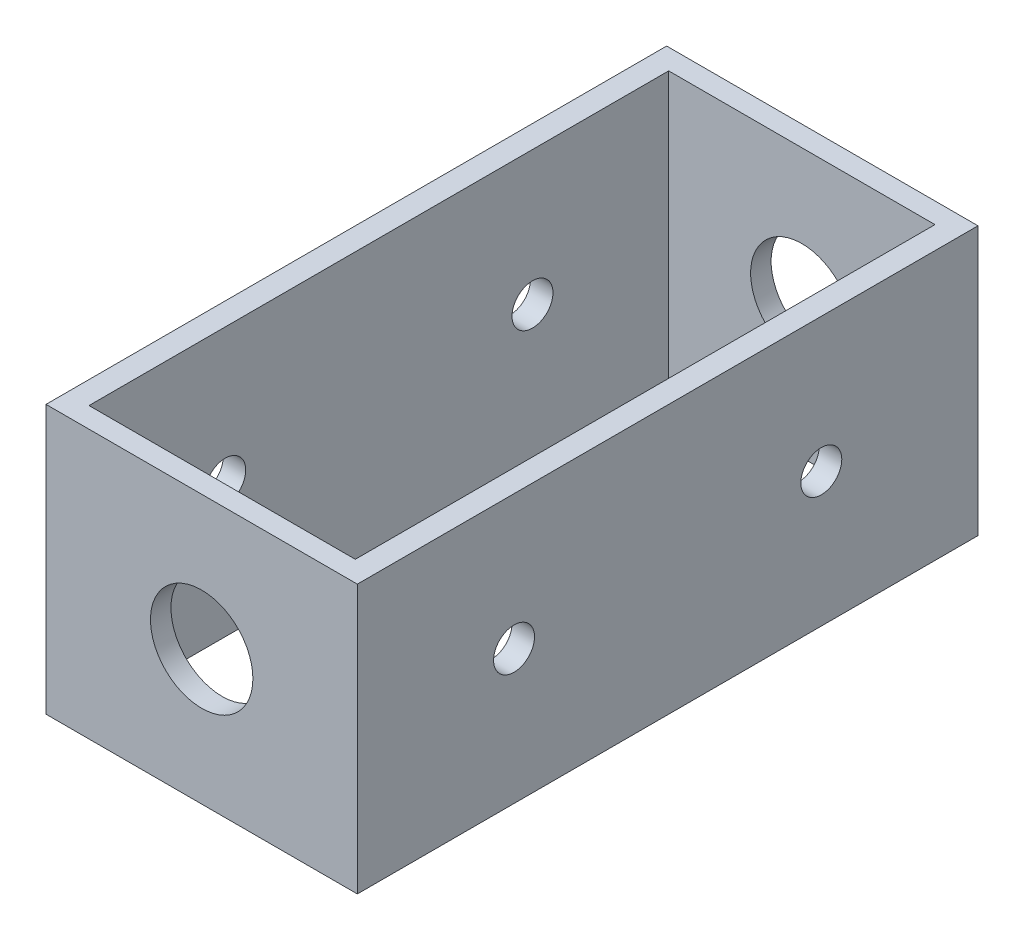
ISO-10303-21;
HEADER;
FILE_DESCRIPTION(('STEP AP214'),'2;1');
FILE_NAME('part.step','',(''),(''),'','','');
FILE_SCHEMA(('AUTOMOTIVE_DESIGN { 1 0 10303 214 1 1 1 1 }'));
ENDSEC;
DATA;
#1=APPLICATION_CONTEXT('core data for automotive mechanical design processes');
#2=APPLICATION_PROTOCOL_DEFINITION('international standard','automotive_design',2000,#1);
#3=PRODUCT_CONTEXT('',#1,'mechanical');
#4=PRODUCT('Part','Part','',(#3));
#5=PRODUCT_RELATED_PRODUCT_CATEGORY('part','',(#4));
#6=PRODUCT_DEFINITION_FORMATION('','',#4);
#7=PRODUCT_DEFINITION_CONTEXT('part definition',#1,'design');
#8=PRODUCT_DEFINITION('design','',#6,#7);
#9=PRODUCT_DEFINITION_SHAPE('','',#8);
#10=(LENGTH_UNIT() NAMED_UNIT(*) SI_UNIT(.MILLI.,.METRE.));
#11=(NAMED_UNIT(*) PLANE_ANGLE_UNIT() SI_UNIT($,.RADIAN.));
#12=(NAMED_UNIT(*) SI_UNIT($,.STERADIAN.) SOLID_ANGLE_UNIT());
#13=UNCERTAINTY_MEASURE_WITH_UNIT(LENGTH_MEASURE(1.E-05),#10,'distance_accuracy_value','');
#14=(GEOMETRIC_REPRESENTATION_CONTEXT(3) GLOBAL_UNCERTAINTY_ASSIGNED_CONTEXT((#13)) GLOBAL_UNIT_ASSIGNED_CONTEXT((#10,
#11,#12)) REPRESENTATION_CONTEXT('',''));
#15=CARTESIAN_POINT('',(0.,0.,0.));
#16=DIRECTION('',(0.,0.,1.));
#17=DIRECTION('',(1.,0.,0.));
#18=AXIS2_PLACEMENT_3D('',#15,#16,#17);
#19=CARTESIAN_POINT('',(0.,13.1,0.));
#20=DIRECTION('',(0.,-1.,0.));
#21=DIRECTION('',(0.,0.,-1.));
#22=AXIS2_PLACEMENT_3D('',#19,#20,#21);
#23=PLANE('',#22);
#24=DIRECTION('',(0.,0.,-1.));
#25=VECTOR('',#24,1.);
#26=CARTESIAN_POINT('',(7.6,13.1,15.15));
#27=LINE('',#26,#25);
#28=CARTESIAN_POINT('',(7.6,13.1,15.15));
#29=VERTEX_POINT('',#28);
#30=CARTESIAN_POINT('',(7.6,13.1,-15.15));
#31=VERTEX_POINT('',#30);
#32=EDGE_CURVE('E157',#29,#31,#27,.T.);
#33=ORIENTED_EDGE('',*,*,#32,.T.);
#34=DIRECTION('',(-1.,0.,0.));
#35=VECTOR('',#34,1.);
#36=CARTESIAN_POINT('',(-7.6,13.1,-15.15));
#37=LINE('',#36,#35);
#38=CARTESIAN_POINT('',(-7.6,13.1,-15.15));
#39=VERTEX_POINT('',#38);
#40=EDGE_CURVE('E161',#31,#39,#37,.T.);
#41=ORIENTED_EDGE('',*,*,#40,.T.);
#42=DIRECTION('',(0.,0.,1.));
#43=VECTOR('',#42,1.);
#44=CARTESIAN_POINT('',(-7.6,13.1,15.15));
#45=LINE('',#44,#43);
#46=CARTESIAN_POINT('',(-7.6,13.1,15.15));
#47=VERTEX_POINT('',#46);
#48=EDGE_CURVE('E165',#39,#47,#45,.T.);
#49=ORIENTED_EDGE('',*,*,#48,.T.);
#50=DIRECTION('',(1.,0.,0.));
#51=VECTOR('',#50,1.);
#52=CARTESIAN_POINT('',(-7.6,13.1,15.15));
#53=LINE('',#52,#51);
#54=EDGE_CURVE('E168',#47,#29,#53,.T.);
#55=ORIENTED_EDGE('',*,*,#54,.T.);
#56=EDGE_LOOP('',(#33,#41,#49,#55));
#57=FACE_BOUND('',#56,.T.);
#58=DIRECTION('',(0.,0.,-1.));
#59=VECTOR('',#58,1.);
#60=CARTESIAN_POINT('',(6.5,13.1,14.15));
#61=LINE('',#60,#59);
#62=CARTESIAN_POINT('',(6.5,13.1,14.15));
#63=VERTEX_POINT('',#62);
#64=CARTESIAN_POINT('',(6.5,13.1,-14.15));
#65=VERTEX_POINT('',#64);
#66=EDGE_CURVE('E107',#63,#65,#61,.T.);
#67=ORIENTED_EDGE('',*,*,#66,.F.);
#68=DIRECTION('',(1.,0.,0.));
#69=VECTOR('',#68,1.);
#70=CARTESIAN_POINT('',(-6.5,13.1,14.15));
#71=LINE('',#70,#69);
#72=CARTESIAN_POINT('',(-6.5,13.1,14.15));
#73=VERTEX_POINT('',#72);
#74=EDGE_CURVE('E133',#73,#63,#71,.T.);
#75=ORIENTED_EDGE('',*,*,#74,.F.);
#76=DIRECTION('',(0.,0.,1.));
#77=VECTOR('',#76,1.);
#78=CARTESIAN_POINT('',(-6.5,13.1,14.15));
#79=LINE('',#78,#77);
#80=CARTESIAN_POINT('',(-6.5,13.1,-14.15));
#81=VERTEX_POINT('',#80);
#82=EDGE_CURVE('E129',#81,#73,#79,.T.);
#83=ORIENTED_EDGE('',*,*,#82,.F.);
#84=DIRECTION('',(-1.,0.,0.));
#85=VECTOR('',#84,1.);
#86=CARTESIAN_POINT('',(-6.5,13.1,-14.15));
#87=LINE('',#86,#85);
#88=EDGE_CURVE('E116',#65,#81,#87,.T.);
#89=ORIENTED_EDGE('',*,*,#88,.F.);
#90=EDGE_LOOP('',(#67,#75,#83,#89));
#91=FACE_BOUND('',#90,.T.);
#92=ADVANCED_FACE('F39',(#57,#91),#23,.F.);
#93=CARTESIAN_POINT('',(0.,0.,0.));
#94=DIRECTION('',(0.,-1.,0.));
#95=DIRECTION('',(0.,0.,-1.));
#96=AXIS2_PLACEMENT_3D('',#93,#94,#95);
#97=PLANE('',#96);
#98=DIRECTION('',(0.,0.,-1.));
#99=VECTOR('',#98,1.);
#100=CARTESIAN_POINT('',(7.6,0.,15.15));
#101=LINE('',#100,#99);
#102=CARTESIAN_POINT('',(7.6,0.,15.15));
#103=VERTEX_POINT('',#102);
#104=CARTESIAN_POINT('',(7.6,0.,-15.15));
#105=VERTEX_POINT('',#104);
#106=EDGE_CURVE('E125',#103,#105,#101,.T.);
#107=ORIENTED_EDGE('',*,*,#106,.F.);
#108=DIRECTION('',(1.,0.,0.));
#109=VECTOR('',#108,1.);
#110=CARTESIAN_POINT('',(-7.6,0.,15.15));
#111=LINE('',#110,#109);
#112=CARTESIAN_POINT('',(-7.6,0.,15.15));
#113=VERTEX_POINT('',#112);
#114=EDGE_CURVE('E162',#113,#103,#111,.T.);
#115=ORIENTED_EDGE('',*,*,#114,.F.);
#116=DIRECTION('',(0.,0.,1.));
#117=VECTOR('',#116,1.);
#118=CARTESIAN_POINT('',(-7.6,0.,15.15));
#119=LINE('',#118,#117);
#120=CARTESIAN_POINT('',(-7.6,0.,-15.15));
#121=VERTEX_POINT('',#120);
#122=EDGE_CURVE('E178',#121,#113,#119,.T.);
#123=ORIENTED_EDGE('',*,*,#122,.F.);
#124=DIRECTION('',(-1.,0.,0.));
#125=VECTOR('',#124,1.);
#126=CARTESIAN_POINT('',(-7.6,0.,-15.15));
#127=LINE('',#126,#125);
#128=EDGE_CURVE('E175',#105,#121,#127,.T.);
#129=ORIENTED_EDGE('',*,*,#128,.F.);
#130=EDGE_LOOP('',(#107,#115,#123,#129));
#131=FACE_BOUND('',#130,.T.);
#132=DIRECTION('',(1.,0.,0.));
#133=VECTOR('',#132,1.);
#134=CARTESIAN_POINT('',(-6.5,0.,14.15));
#135=LINE('',#134,#133);
#136=CARTESIAN_POINT('',(-6.5,0.,14.15));
#137=VERTEX_POINT('',#136);
#138=CARTESIAN_POINT('',(6.5,0.,14.15));
#139=VERTEX_POINT('',#138);
#140=EDGE_CURVE('E117',#137,#139,#135,.T.);
#141=ORIENTED_EDGE('',*,*,#140,.T.);
#142=DIRECTION('',(0.,0.,-1.));
#143=VECTOR('',#142,1.);
#144=CARTESIAN_POINT('',(6.5,0.,14.15));
#145=LINE('',#144,#143);
#146=CARTESIAN_POINT('',(6.5,0.,-14.15));
#147=VERTEX_POINT('',#146);
#148=EDGE_CURVE('E65',#139,#147,#145,.T.);
#149=ORIENTED_EDGE('',*,*,#148,.T.);
#150=DIRECTION('',(-1.,0.,0.));
#151=VECTOR('',#150,1.);
#152=CARTESIAN_POINT('',(-6.5,0.,-14.15));
#153=LINE('',#152,#151);
#154=CARTESIAN_POINT('',(-6.5,0.,-14.15));
#155=VERTEX_POINT('',#154);
#156=EDGE_CURVE('E123',#147,#155,#153,.T.);
#157=ORIENTED_EDGE('',*,*,#156,.T.);
#158=DIRECTION('',(0.,0.,1.));
#159=VECTOR('',#158,1.);
#160=CARTESIAN_POINT('',(-6.5,0.,14.15));
#161=LINE('',#160,#159);
#162=EDGE_CURVE('E144',#155,#137,#161,.T.);
#163=ORIENTED_EDGE('',*,*,#162,.T.);
#164=EDGE_LOOP('',(#141,#149,#157,#163));
#165=FACE_BOUND('',#164,.T.);
#166=ADVANCED_FACE('F253',(#131,#165),#97,.T.);
#167=CARTESIAN_POINT('',(7.6,13.1,15.15));
#168=DIRECTION('',(-1.,0.,0.));
#169=DIRECTION('',(0.,0.,1.));
#170=AXIS2_PLACEMENT_3D('',#167,#168,#169);
#171=PLANE('',#170);
#172=CARTESIAN_POINT('',(7.6,6.55,7.5));
#173=DIRECTION('',(1.,0.,0.));
#174=DIRECTION('',(0.,0.,-1.));
#175=AXIS2_PLACEMENT_3D('',#172,#173,#174);
#176=CIRCLE('',#175,1.);
#177=CARTESIAN_POINT('',(7.6,6.55,6.5));
#178=VERTEX_POINT('',#177);
#179=EDGE_CURVE('E220',#178,#178,#176,.T.);
#180=ORIENTED_EDGE('',*,*,#179,.F.);
#181=EDGE_LOOP('',(#180));
#182=FACE_BOUND('',#181,.T.);
#183=CARTESIAN_POINT('',(7.6,6.55,-7.5));
#184=DIRECTION('',(1.,0.,0.));
#185=DIRECTION('',(0.,0.,-1.));
#186=AXIS2_PLACEMENT_3D('',#183,#184,#185);
#187=CIRCLE('',#186,1.);
#188=CARTESIAN_POINT('',(7.6,6.55,-8.5));
#189=VERTEX_POINT('',#188);
#190=EDGE_CURVE('E211',#189,#189,#187,.T.);
#191=ORIENTED_EDGE('',*,*,#190,.F.);
#192=EDGE_LOOP('',(#191));
#193=FACE_BOUND('',#192,.T.);
#194=ORIENTED_EDGE('',*,*,#106,.T.);
#195=DIRECTION('',(0.,-1.,0.));
#196=VECTOR('',#195,1.);
#197=CARTESIAN_POINT('',(7.6,13.1,-15.15));
#198=LINE('',#197,#196);
#199=EDGE_CURVE('E11',#31,#105,#198,.T.);
#200=ORIENTED_EDGE('',*,*,#199,.F.);
#201=ORIENTED_EDGE('',*,*,#32,.F.);
#202=DIRECTION('',(0.,-1.,0.));
#203=VECTOR('',#202,1.);
#204=CARTESIAN_POINT('',(7.6,13.1,15.15));
#205=LINE('',#204,#203);
#206=EDGE_CURVE('E171',#29,#103,#205,.T.);
#207=ORIENTED_EDGE('',*,*,#206,.T.);
#208=EDGE_LOOP('',(#194,#200,#201,#207));
#209=FACE_BOUND('',#208,.T.);
#210=ADVANCED_FACE('F41',(#182,#193,#209),#171,.F.);
#211=CARTESIAN_POINT('',(-7.6,13.1,-15.15));
#212=DIRECTION('',(0.,0.,1.));
#213=DIRECTION('',(1.,0.,0.));
#214=AXIS2_PLACEMENT_3D('',#211,#212,#213);
#215=PLANE('',#214);
#216=CARTESIAN_POINT('',(0.,6.55,-15.15));
#217=DIRECTION('',(0.,0.,1.));
#218=DIRECTION('',(1.,0.,0.));
#219=AXIS2_PLACEMENT_3D('',#216,#217,#218);
#220=CIRCLE('',#219,2.5);
#221=CARTESIAN_POINT('',(2.5,6.55,-15.15));
#222=VERTEX_POINT('',#221);
#223=EDGE_CURVE('E234',#222,#222,#220,.T.);
#224=ORIENTED_EDGE('',*,*,#223,.T.);
#225=EDGE_LOOP('',(#224));
#226=FACE_BOUND('',#225,.T.);
#227=ORIENTED_EDGE('',*,*,#128,.T.);
#228=DIRECTION('',(0.,-1.,0.));
#229=VECTOR('',#228,1.);
#230=CARTESIAN_POINT('',(-7.6,13.1,-15.15));
#231=LINE('',#230,#229);
#232=EDGE_CURVE('E49',#39,#121,#231,.T.);
#233=ORIENTED_EDGE('',*,*,#232,.F.);
#234=ORIENTED_EDGE('',*,*,#40,.F.);
#235=ORIENTED_EDGE('',*,*,#199,.T.);
#236=EDGE_LOOP('',(#227,#233,#234,#235));
#237=FACE_BOUND('',#236,.T.);
#238=ADVANCED_FACE('F280',(#226,#237),#215,.F.);
#239=CARTESIAN_POINT('',(-7.6,13.1,15.15));
#240=DIRECTION('',(1.,0.,0.));
#241=DIRECTION('',(0.,0.,-1.));
#242=AXIS2_PLACEMENT_3D('',#239,#240,#241);
#243=PLANE('',#242);
#244=CARTESIAN_POINT('',(-7.6,6.55,7.5));
#245=DIRECTION('',(1.,0.,0.));
#246=DIRECTION('',(0.,0.,-1.));
#247=AXIS2_PLACEMENT_3D('',#244,#245,#246);
#248=CIRCLE('',#247,1.);
#249=CARTESIAN_POINT('',(-7.6,6.55,6.5));
#250=VERTEX_POINT('',#249);
#251=EDGE_CURVE('E197',#250,#250,#248,.T.);
#252=ORIENTED_EDGE('',*,*,#251,.T.);
#253=EDGE_LOOP('',(#252));
#254=FACE_BOUND('',#253,.T.);
#255=CARTESIAN_POINT('',(-7.6,6.55,-7.5));
#256=DIRECTION('',(1.,0.,0.));
#257=DIRECTION('',(0.,0.,-1.));
#258=AXIS2_PLACEMENT_3D('',#255,#256,#257);
#259=CIRCLE('',#258,1.);
#260=CARTESIAN_POINT('',(-7.6,6.55,-8.5));
#261=VERTEX_POINT('',#260);
#262=EDGE_CURVE('E215',#261,#261,#259,.T.);
#263=ORIENTED_EDGE('',*,*,#262,.T.);
#264=EDGE_LOOP('',(#263));
#265=FACE_BOUND('',#264,.T.);
#266=ORIENTED_EDGE('',*,*,#122,.T.);
#267=DIRECTION('',(0.,-1.,0.));
#268=VECTOR('',#267,1.);
#269=CARTESIAN_POINT('',(-7.6,13.1,15.15));
#270=LINE('',#269,#268);
#271=EDGE_CURVE('E186',#47,#113,#270,.T.);
#272=ORIENTED_EDGE('',*,*,#271,.F.);
#273=ORIENTED_EDGE('',*,*,#48,.F.);
#274=ORIENTED_EDGE('',*,*,#232,.T.);
#275=EDGE_LOOP('',(#266,#272,#273,#274));
#276=FACE_BOUND('',#275,.T.);
#277=ADVANCED_FACE('F277',(#254,#265,#276),#243,.F.);
#278=CARTESIAN_POINT('',(-7.6,13.1,15.15));
#279=DIRECTION('',(0.,0.,-1.));
#280=DIRECTION('',(-1.,0.,0.));
#281=AXIS2_PLACEMENT_3D('',#278,#279,#280);
#282=PLANE('',#281);
#283=CARTESIAN_POINT('',(0.,6.55,15.15));
#284=DIRECTION('',(0.,0.,1.));
#285=DIRECTION('',(1.,0.,0.));
#286=AXIS2_PLACEMENT_3D('',#283,#284,#285);
#287=CIRCLE('',#286,2.5);
#288=CARTESIAN_POINT('',(2.5,6.55,15.15));
#289=VERTEX_POINT('',#288);
#290=EDGE_CURVE('E230',#289,#289,#287,.T.);
#291=ORIENTED_EDGE('',*,*,#290,.F.);
#292=EDGE_LOOP('',(#291));
#293=FACE_BOUND('',#292,.T.);
#294=ORIENTED_EDGE('',*,*,#114,.T.);
#295=ORIENTED_EDGE('',*,*,#206,.F.);
#296=ORIENTED_EDGE('',*,*,#54,.F.);
#297=ORIENTED_EDGE('',*,*,#271,.T.);
#298=EDGE_LOOP('',(#294,#295,#296,#297));
#299=FACE_BOUND('',#298,.T.);
#300=ADVANCED_FACE('F274',(#293,#299),#282,.F.);
#301=CARTESIAN_POINT('',(6.5,13.1,14.15));
#302=DIRECTION('',(-1.,0.,0.));
#303=DIRECTION('',(0.,0.,1.));
#304=AXIS2_PLACEMENT_3D('',#301,#302,#303);
#305=PLANE('',#304);
#306=CARTESIAN_POINT('',(6.5,6.55,7.5));
#307=DIRECTION('',(-1.,0.,0.));
#308=DIRECTION('',(0.,0.,1.));
#309=AXIS2_PLACEMENT_3D('',#306,#307,#308);
#310=CIRCLE('',#309,1.);
#311=CARTESIAN_POINT('',(6.5,6.55,8.5));
#312=VERTEX_POINT('',#311);
#313=EDGE_CURVE('E141',#312,#312,#310,.T.);
#314=ORIENTED_EDGE('',*,*,#313,.F.);
#315=EDGE_LOOP('',(#314));
#316=FACE_BOUND('',#315,.T.);
#317=CARTESIAN_POINT('',(6.5,6.55,-7.5));
#318=DIRECTION('',(-1.,0.,0.));
#319=DIRECTION('',(0.,0.,1.));
#320=AXIS2_PLACEMENT_3D('',#317,#318,#319);
#321=CIRCLE('',#320,1.);
#322=CARTESIAN_POINT('',(6.5,6.55,-6.5));
#323=VERTEX_POINT('',#322);
#324=EDGE_CURVE('E196',#323,#323,#321,.T.);
#325=ORIENTED_EDGE('',*,*,#324,.F.);
#326=EDGE_LOOP('',(#325));
#327=FACE_BOUND('',#326,.T.);
#328=ORIENTED_EDGE('',*,*,#148,.F.);
#329=DIRECTION('',(0.,-1.,0.));
#330=VECTOR('',#329,1.);
#331=CARTESIAN_POINT('',(6.5,13.1,14.15));
#332=LINE('',#331,#330);
#333=EDGE_CURVE('E111',#63,#139,#332,.T.);
#334=ORIENTED_EDGE('',*,*,#333,.F.);
#335=ORIENTED_EDGE('',*,*,#66,.T.);
#336=DIRECTION('',(0.,-1.,0.));
#337=VECTOR('',#336,1.);
#338=CARTESIAN_POINT('',(6.5,13.1,-14.15));
#339=LINE('',#338,#337);
#340=EDGE_CURVE('E110',#65,#147,#339,.T.);
#341=ORIENTED_EDGE('',*,*,#340,.T.);
#342=EDGE_LOOP('',(#328,#334,#335,#341));
#343=FACE_BOUND('',#342,.T.);
#344=ADVANCED_FACE('F109',(#316,#327,#343),#305,.T.);
#345=CARTESIAN_POINT('',(-6.5,13.1,-14.15));
#346=DIRECTION('',(0.,0.,1.));
#347=DIRECTION('',(1.,0.,0.));
#348=AXIS2_PLACEMENT_3D('',#345,#346,#347);
#349=PLANE('',#348);
#350=CARTESIAN_POINT('',(0.,6.55,-14.15));
#351=DIRECTION('',(0.,0.,1.));
#352=DIRECTION('',(1.,0.,0.));
#353=AXIS2_PLACEMENT_3D('',#350,#351,#352);
#354=CIRCLE('',#353,2.5);
#355=CARTESIAN_POINT('',(2.5,6.55,-14.15));
#356=VERTEX_POINT('',#355);
#357=EDGE_CURVE('E216',#356,#356,#354,.T.);
#358=ORIENTED_EDGE('',*,*,#357,.F.);
#359=EDGE_LOOP('',(#358));
#360=FACE_BOUND('',#359,.T.);
#361=ORIENTED_EDGE('',*,*,#156,.F.);
#362=ORIENTED_EDGE('',*,*,#340,.F.);
#363=ORIENTED_EDGE('',*,*,#88,.T.);
#364=DIRECTION('',(0.,-1.,0.));
#365=VECTOR('',#364,1.);
#366=CARTESIAN_POINT('',(-6.5,13.1,-14.15));
#367=LINE('',#366,#365);
#368=EDGE_CURVE('E126',#81,#155,#367,.T.);
#369=ORIENTED_EDGE('',*,*,#368,.T.);
#370=EDGE_LOOP('',(#361,#362,#363,#369));
#371=FACE_BOUND('',#370,.T.);
#372=ADVANCED_FACE('F120',(#360,#371),#349,.T.);
#373=CARTESIAN_POINT('',(-6.5,13.1,14.15));
#374=DIRECTION('',(1.,0.,0.));
#375=DIRECTION('',(0.,0.,-1.));
#376=AXIS2_PLACEMENT_3D('',#373,#374,#375);
#377=PLANE('',#376);
#378=CARTESIAN_POINT('',(-6.5,6.55,7.5));
#379=DIRECTION('',(1.,0.,0.));
#380=DIRECTION('',(0.,0.,-1.));
#381=AXIS2_PLACEMENT_3D('',#378,#379,#380);
#382=CIRCLE('',#381,1.);
#383=CARTESIAN_POINT('',(-6.5,6.55,6.5));
#384=VERTEX_POINT('',#383);
#385=EDGE_CURVE('E198',#384,#384,#382,.T.);
#386=ORIENTED_EDGE('',*,*,#385,.F.);
#387=EDGE_LOOP('',(#386));
#388=FACE_BOUND('',#387,.T.);
#389=CARTESIAN_POINT('',(-6.5,6.55,-7.5));
#390=DIRECTION('',(1.,0.,0.));
#391=DIRECTION('',(0.,0.,-1.));
#392=AXIS2_PLACEMENT_3D('',#389,#390,#391);
#393=CIRCLE('',#392,1.);
#394=CARTESIAN_POINT('',(-6.5,6.55,-8.5));
#395=VERTEX_POINT('',#394);
#396=EDGE_CURVE('E193',#395,#395,#393,.T.);
#397=ORIENTED_EDGE('',*,*,#396,.F.);
#398=EDGE_LOOP('',(#397));
#399=FACE_BOUND('',#398,.T.);
#400=ORIENTED_EDGE('',*,*,#162,.F.);
#401=ORIENTED_EDGE('',*,*,#368,.F.);
#402=ORIENTED_EDGE('',*,*,#82,.T.);
#403=DIRECTION('',(0.,-1.,0.));
#404=VECTOR('',#403,1.);
#405=CARTESIAN_POINT('',(-6.5,13.1,14.15));
#406=LINE('',#405,#404);
#407=EDGE_CURVE('E57',#73,#137,#406,.T.);
#408=ORIENTED_EDGE('',*,*,#407,.T.);
#409=EDGE_LOOP('',(#400,#401,#402,#408));
#410=FACE_BOUND('',#409,.T.);
#411=ADVANCED_FACE('F249',(#388,#399,#410),#377,.T.);
#412=CARTESIAN_POINT('',(-6.5,13.1,14.15));
#413=DIRECTION('',(0.,0.,-1.));
#414=DIRECTION('',(-1.,0.,0.));
#415=AXIS2_PLACEMENT_3D('',#412,#413,#414);
#416=PLANE('',#415);
#417=CARTESIAN_POINT('',(0.,6.55,14.15));
#418=DIRECTION('',(0.,0.,-1.));
#419=DIRECTION('',(-1.,0.,0.));
#420=AXIS2_PLACEMENT_3D('',#417,#418,#419);
#421=CIRCLE('',#420,2.5);
#422=CARTESIAN_POINT('',(-2.5,6.55,14.15));
#423=VERTEX_POINT('',#422);
#424=EDGE_CURVE('E43',#423,#423,#421,.T.);
#425=ORIENTED_EDGE('',*,*,#424,.F.);
#426=EDGE_LOOP('',(#425));
#427=FACE_BOUND('',#426,.T.);
#428=ORIENTED_EDGE('',*,*,#140,.F.);
#429=ORIENTED_EDGE('',*,*,#407,.F.);
#430=ORIENTED_EDGE('',*,*,#74,.T.);
#431=ORIENTED_EDGE('',*,*,#333,.T.);
#432=EDGE_LOOP('',(#428,#429,#430,#431));
#433=FACE_BOUND('',#432,.T.);
#434=ADVANCED_FACE('F246',(#427,#433),#416,.T.);
#435=CARTESIAN_POINT('',(-7.6,6.55,-7.5));
#436=DIRECTION('',(1.,0.,0.));
#437=DIRECTION('',(0.,0.,-1.));
#438=AXIS2_PLACEMENT_3D('',#435,#436,#437);
#439=CYLINDRICAL_SURFACE('',#438,1.);
#440=ORIENTED_EDGE('',*,*,#396,.T.);
#441=EDGE_LOOP('',(#440));
#442=FACE_BOUND('',#441,.T.);
#443=ORIENTED_EDGE('',*,*,#262,.F.);
#444=EDGE_LOOP('',(#443));
#445=FACE_BOUND('',#444,.T.);
#446=ADVANCED_FACE('F248',(#442,#445),#439,.F.);
#447=CARTESIAN_POINT('',(-7.6,6.55,7.5));
#448=DIRECTION('',(1.,0.,0.));
#449=DIRECTION('',(0.,0.,-1.));
#450=AXIS2_PLACEMENT_3D('',#447,#448,#449);
#451=CYLINDRICAL_SURFACE('',#450,1.);
#452=ORIENTED_EDGE('',*,*,#385,.T.);
#453=EDGE_LOOP('',(#452));
#454=FACE_BOUND('',#453,.T.);
#455=ORIENTED_EDGE('',*,*,#251,.F.);
#456=EDGE_LOOP('',(#455));
#457=FACE_BOUND('',#456,.T.);
#458=ADVANCED_FACE('F310',(#454,#457),#451,.F.);
#459=ORIENTED_EDGE('',*,*,#324,.T.);
#460=EDGE_LOOP('',(#459));
#461=FACE_BOUND('',#460,.T.);
#462=ORIENTED_EDGE('',*,*,#190,.T.);
#463=EDGE_LOOP('',(#462));
#464=FACE_BOUND('',#463,.T.);
#465=ADVANCED_FACE('F307',(#461,#464),#439,.F.);
#466=ORIENTED_EDGE('',*,*,#313,.T.);
#467=EDGE_LOOP('',(#466));
#468=FACE_BOUND('',#467,.T.);
#469=ORIENTED_EDGE('',*,*,#179,.T.);
#470=EDGE_LOOP('',(#469));
#471=FACE_BOUND('',#470,.T.);
#472=ADVANCED_FACE('F309',(#468,#471),#451,.F.);
#473=CARTESIAN_POINT('',(0.,6.55,-15.15));
#474=DIRECTION('',(0.,0.,1.));
#475=DIRECTION('',(1.,0.,0.));
#476=AXIS2_PLACEMENT_3D('',#473,#474,#475);
#477=CYLINDRICAL_SURFACE('',#476,2.5);
#478=ORIENTED_EDGE('',*,*,#424,.T.);
#479=EDGE_LOOP('',(#478));
#480=FACE_BOUND('',#479,.T.);
#481=ORIENTED_EDGE('',*,*,#290,.T.);
#482=EDGE_LOOP('',(#481));
#483=FACE_BOUND('',#482,.T.);
#484=ADVANCED_FACE('F243',(#480,#483),#477,.F.);
#485=ORIENTED_EDGE('',*,*,#357,.T.);
#486=EDGE_LOOP('',(#485));
#487=FACE_BOUND('',#486,.T.);
#488=ORIENTED_EDGE('',*,*,#223,.F.);
#489=EDGE_LOOP('',(#488));
#490=FACE_BOUND('',#489,.T.);
#491=ADVANCED_FACE('F376',(#487,#490),#477,.F.);
#492=CLOSED_SHELL('',(#92,#166,#210,#238,#277,#300,#344,#372,#411,#434,#446,#458,#465,#472,#484,#491));
#493=MANIFOLD_SOLID_BREP('B2',#492);
#494=ADVANCED_BREP_SHAPE_REPRESENTATION('',(#18,#493),#14);
#495=SHAPE_DEFINITION_REPRESENTATION(#9,#494);
ENDSEC;
END-ISO-10303-21;
